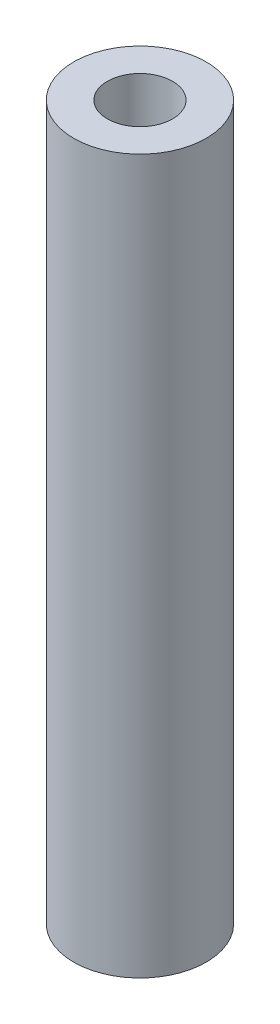
ISO-10303-21;
HEADER;
FILE_DESCRIPTION(('STEP AP214'),'2;1');
FILE_NAME('part.step','',(''),(''),'','','');
FILE_SCHEMA(('AUTOMOTIVE_DESIGN { 1 0 10303 214 1 1 1 1 }'));
ENDSEC;
DATA;
#1=APPLICATION_CONTEXT('core data for automotive mechanical design processes');
#2=APPLICATION_PROTOCOL_DEFINITION('international standard','automotive_design',2000,#1);
#3=PRODUCT_CONTEXT('',#1,'mechanical');
#4=PRODUCT('Part','Part','',(#3));
#5=PRODUCT_RELATED_PRODUCT_CATEGORY('part','',(#4));
#6=PRODUCT_DEFINITION_FORMATION('','',#4);
#7=PRODUCT_DEFINITION_CONTEXT('part definition',#1,'design');
#8=PRODUCT_DEFINITION('design','',#6,#7);
#9=PRODUCT_DEFINITION_SHAPE('','',#8);
#10=(LENGTH_UNIT() NAMED_UNIT(*) SI_UNIT(.MILLI.,.METRE.));
#11=(NAMED_UNIT(*) PLANE_ANGLE_UNIT() SI_UNIT($,.RADIAN.));
#12=(NAMED_UNIT(*) SI_UNIT($,.STERADIAN.) SOLID_ANGLE_UNIT());
#13=UNCERTAINTY_MEASURE_WITH_UNIT(LENGTH_MEASURE(1.E-05),#10,'distance_accuracy_value','');
#14=(GEOMETRIC_REPRESENTATION_CONTEXT(3) GLOBAL_UNCERTAINTY_ASSIGNED_CONTEXT((#13)) GLOBAL_UNIT_ASSIGNED_CONTEXT((#10,
#11,#12)) REPRESENTATION_CONTEXT('',''));
#15=CARTESIAN_POINT('',(0.,0.,0.));
#16=DIRECTION('',(0.,0.,1.));
#17=DIRECTION('',(1.,0.,0.));
#18=AXIS2_PLACEMENT_3D('',#15,#16,#17);
#19=CARTESIAN_POINT('',(0.,35.,0.));
#20=DIRECTION('',(0.,1.,0.));
#21=DIRECTION('',(0.,0.,1.));
#22=AXIS2_PLACEMENT_3D('',#19,#20,#21);
#23=PLANE('',#22);
#24=CARTESIAN_POINT('',(0.,35.,0.));
#25=DIRECTION('',(0.,1.,0.));
#26=DIRECTION('',(0.,0.,1.));
#27=AXIS2_PLACEMENT_3D('',#24,#25,#26);
#28=CIRCLE('',#27,3.25);
#29=CARTESIAN_POINT('',(0.,35.,3.25));
#30=VERTEX_POINT('',#29);
#31=EDGE_CURVE('E10',#30,#30,#28,.T.);
#32=ORIENTED_EDGE('',*,*,#31,.T.);
#33=EDGE_LOOP('',(#32));
#34=FACE_BOUND('',#33,.T.);
#35=CARTESIAN_POINT('',(0.,35.,0.));
#36=DIRECTION('',(0.,1.,0.));
#37=DIRECTION('',(0.,0.,1.));
#38=AXIS2_PLACEMENT_3D('',#35,#36,#37);
#39=CIRCLE('',#38,1.6);
#40=CARTESIAN_POINT('',(0.,35.,1.6));
#41=VERTEX_POINT('',#40);
#42=EDGE_CURVE('E54',#41,#41,#39,.T.);
#43=ORIENTED_EDGE('',*,*,#42,.F.);
#44=EDGE_LOOP('',(#43));
#45=FACE_BOUND('',#44,.T.);
#46=ADVANCED_FACE('F41',(#34,#45),#23,.T.);
#47=CARTESIAN_POINT('',(0.,0.,0.));
#48=DIRECTION('',(0.,1.,0.));
#49=DIRECTION('',(0.,0.,1.));
#50=AXIS2_PLACEMENT_3D('',#47,#48,#49);
#51=PLANE('',#50);
#52=CARTESIAN_POINT('',(0.,0.,0.));
#53=DIRECTION('',(0.,1.,0.));
#54=DIRECTION('',(0.,0.,1.));
#55=AXIS2_PLACEMENT_3D('',#52,#53,#54);
#56=CIRCLE('',#55,3.25);
#57=CARTESIAN_POINT('',(0.,0.,3.25));
#58=VERTEX_POINT('',#57);
#59=EDGE_CURVE('E45',#58,#58,#56,.T.);
#60=ORIENTED_EDGE('',*,*,#59,.F.);
#61=EDGE_LOOP('',(#60));
#62=FACE_BOUND('',#61,.T.);
#63=CARTESIAN_POINT('',(0.,0.,0.));
#64=DIRECTION('',(0.,1.,0.));
#65=DIRECTION('',(0.,0.,1.));
#66=AXIS2_PLACEMENT_3D('',#63,#64,#65);
#67=CIRCLE('',#66,1.6);
#68=CARTESIAN_POINT('',(0.,0.,1.6));
#69=VERTEX_POINT('',#68);
#70=EDGE_CURVE('E56',#69,#69,#67,.T.);
#71=ORIENTED_EDGE('',*,*,#70,.T.);
#72=EDGE_LOOP('',(#71));
#73=FACE_BOUND('',#72,.T.);
#74=ADVANCED_FACE('F68',(#62,#73),#51,.F.);
#75=CARTESIAN_POINT('',(0.,35.,0.));
#76=DIRECTION('',(0.,-1.,0.));
#77=DIRECTION('',(0.,0.,-1.));
#78=AXIS2_PLACEMENT_3D('',#75,#76,#77);
#79=CYLINDRICAL_SURFACE('',#78,3.25);
#80=ORIENTED_EDGE('',*,*,#31,.F.);
#81=EDGE_LOOP('',(#80));
#82=FACE_BOUND('',#81,.T.);
#83=ORIENTED_EDGE('',*,*,#59,.T.);
#84=EDGE_LOOP('',(#83));
#85=FACE_BOUND('',#84,.T.);
#86=ADVANCED_FACE('F43',(#82,#85),#79,.T.);
#87=CARTESIAN_POINT('',(0.,35.,0.));
#88=DIRECTION('',(0.,-1.,0.));
#89=DIRECTION('',(0.,0.,-1.));
#90=AXIS2_PLACEMENT_3D('',#87,#88,#89);
#91=CYLINDRICAL_SURFACE('',#90,1.6);
#92=ORIENTED_EDGE('',*,*,#42,.T.);
#93=EDGE_LOOP('',(#92));
#94=FACE_BOUND('',#93,.T.);
#95=ORIENTED_EDGE('',*,*,#70,.F.);
#96=EDGE_LOOP('',(#95));
#97=FACE_BOUND('',#96,.T.);
#98=ADVANCED_FACE('F64',(#94,#97),#91,.F.);
#99=CLOSED_SHELL('',(#46,#74,#86,#98));
#100=MANIFOLD_SOLID_BREP('B2',#99);
#101=ADVANCED_BREP_SHAPE_REPRESENTATION('',(#18,#100),#14);
#102=SHAPE_DEFINITION_REPRESENTATION(#9,#101);
ENDSEC;
END-ISO-10303-21;
